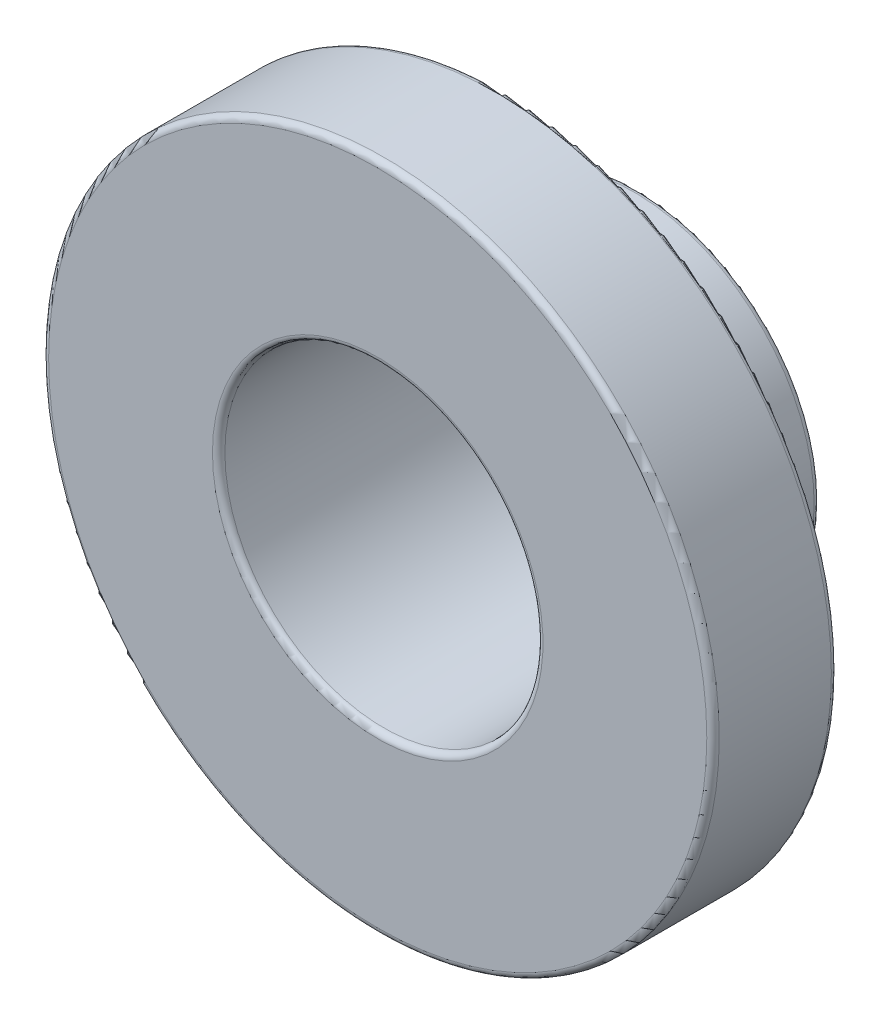
ISO-10303-21;
HEADER;
FILE_DESCRIPTION(('STEP AP214'),'2;1');
FILE_NAME('part.step','',(''),(''),'','','');
FILE_SCHEMA(('AUTOMOTIVE_DESIGN { 1 0 10303 214 1 1 1 1 }'));
ENDSEC;
DATA;
#1=APPLICATION_CONTEXT('core data for automotive mechanical design processes');
#2=APPLICATION_PROTOCOL_DEFINITION('international standard','automotive_design',2000,#1);
#3=PRODUCT_CONTEXT('',#1,'mechanical');
#4=PRODUCT('Part','Part','',(#3));
#5=PRODUCT_RELATED_PRODUCT_CATEGORY('part','',(#4));
#6=PRODUCT_DEFINITION_FORMATION('','',#4);
#7=PRODUCT_DEFINITION_CONTEXT('part definition',#1,'design');
#8=PRODUCT_DEFINITION('design','',#6,#7);
#9=PRODUCT_DEFINITION_SHAPE('','',#8);
#10=(LENGTH_UNIT() NAMED_UNIT(*) SI_UNIT(.MILLI.,.METRE.));
#11=(NAMED_UNIT(*) PLANE_ANGLE_UNIT() SI_UNIT($,.RADIAN.));
#12=(NAMED_UNIT(*) SI_UNIT($,.STERADIAN.) SOLID_ANGLE_UNIT());
#13=UNCERTAINTY_MEASURE_WITH_UNIT(LENGTH_MEASURE(1.E-05),#10,'distance_accuracy_value','');
#14=(GEOMETRIC_REPRESENTATION_CONTEXT(3) GLOBAL_UNCERTAINTY_ASSIGNED_CONTEXT((#13)) GLOBAL_UNIT_ASSIGNED_CONTEXT((#10,
#11,#12)) REPRESENTATION_CONTEXT('',''));
#15=CARTESIAN_POINT('',(0.,0.,0.));
#16=DIRECTION('',(0.,0.,1.));
#17=DIRECTION('',(1.,0.,0.));
#18=AXIS2_PLACEMENT_3D('',#15,#16,#17);
#19=CARTESIAN_POINT('',(0.,3.2131,1.2573));
#20=DIRECTION('',(0.,0.,-1.));
#21=DIRECTION('',(-1.,0.,0.));
#22=AXIS2_PLACEMENT_3D('',#19,#20,#21);
#23=PLANE('',#22);
#24=CARTESIAN_POINT('',(0.,0.,1.2573));
#25=DIRECTION('',(0.,0.,-1.));
#26=DIRECTION('',(-1.,0.,0.));
#27=AXIS2_PLACEMENT_3D('',#24,#25,#26);
#28=CIRCLE('',#27,1.58369);
#29=CARTESIAN_POINT('',(-1.58369,0.,1.2573));
#30=VERTEX_POINT('',#29);
#31=EDGE_CURVE('E62',#30,#30,#28,.T.);
#32=ORIENTED_EDGE('',*,*,#31,.T.);
#33=EDGE_LOOP('',(#32));
#34=FACE_BOUND('',#33,.T.);
#35=CARTESIAN_POINT('',(0.,0.,1.2573));
#36=DIRECTION('',(0.,0.,-1.));
#37=DIRECTION('',(-1.,0.,0.));
#38=AXIS2_PLACEMENT_3D('',#35,#36,#37);
#39=CIRCLE('',#38,3.15341);
#40=CARTESIAN_POINT('',(-3.15341,0.,1.2573));
#41=VERTEX_POINT('',#40);
#42=EDGE_CURVE('E65',#41,#41,#39,.F.);
#43=ORIENTED_EDGE('',*,*,#42,.T.);
#44=EDGE_LOOP('',(#43));
#45=FACE_BOUND('',#44,.T.);
#46=ADVANCED_FACE('F30',(#34,#45),#23,.F.);
#47=CARTESIAN_POINT('',(0.,0.,1.2573));
#48=DIRECTION('',(0.,0.,1.));
#49=DIRECTION('',(1.,0.,0.));
#50=AXIS2_PLACEMENT_3D('',#47,#48,#49);
#51=CYLINDRICAL_SURFACE('',#50,1.524);
#52=CARTESIAN_POINT('',(0.,0.,1.19761));
#53=DIRECTION('',(0.,0.,-1.));
#54=DIRECTION('',(-1.,0.,0.));
#55=AXIS2_PLACEMENT_3D('',#52,#53,#54);
#56=CIRCLE('',#55,1.524);
#57=CARTESIAN_POINT('',(-1.524,0.,1.19761));
#58=VERTEX_POINT('',#57);
#59=EDGE_CURVE('E68',#58,#58,#56,.F.);
#60=ORIENTED_EDGE('',*,*,#59,.T.);
#61=EDGE_LOOP('',(#60));
#62=FACE_BOUND('',#61,.T.);
#63=CARTESIAN_POINT('',(0.,0.,-1.19761));
#64=DIRECTION('',(0.,0.,1.));
#65=DIRECTION('',(1.,0.,0.));
#66=AXIS2_PLACEMENT_3D('',#63,#64,#65);
#67=CIRCLE('',#66,1.524);
#68=CARTESIAN_POINT('',(1.524,0.,-1.19761));
#69=VERTEX_POINT('',#68);
#70=EDGE_CURVE('E71',#69,#69,#67,.F.);
#71=ORIENTED_EDGE('',*,*,#70,.T.);
#72=EDGE_LOOP('',(#71));
#73=FACE_BOUND('',#72,.T.);
#74=ADVANCED_FACE('F75',(#62,#73),#51,.F.);
#75=CARTESIAN_POINT('',(0.,1.524,-1.2573));
#76=DIRECTION('',(0.,0.,1.));
#77=DIRECTION('',(1.,0.,0.));
#78=AXIS2_PLACEMENT_3D('',#75,#76,#77);
#79=PLANE('',#78);
#80=CARTESIAN_POINT('',(0.,0.,-1.2573));
#81=DIRECTION('',(0.,0.,1.));
#82=DIRECTION('',(1.,0.,0.));
#83=AXIS2_PLACEMENT_3D('',#80,#81,#82);
#84=CIRCLE('',#83,1.58369);
#85=CARTESIAN_POINT('',(1.58369,0.,-1.2573));
#86=VERTEX_POINT('',#85);
#87=EDGE_CURVE('E56',#86,#86,#84,.T.);
#88=ORIENTED_EDGE('',*,*,#87,.T.);
#89=EDGE_LOOP('',(#88));
#90=FACE_BOUND('',#89,.T.);
#91=CARTESIAN_POINT('',(0.,0.,-1.2573));
#92=DIRECTION('',(0.,0.,1.));
#93=DIRECTION('',(1.,0.,0.));
#94=AXIS2_PLACEMENT_3D('',#91,#92,#93);
#95=CIRCLE('',#94,1.66751);
#96=CARTESIAN_POINT('',(1.66751,0.,-1.2573));
#97=VERTEX_POINT('',#96);
#98=EDGE_CURVE('E59',#97,#97,#95,.F.);
#99=ORIENTED_EDGE('',*,*,#98,.T.);
#100=EDGE_LOOP('',(#99));
#101=FACE_BOUND('',#100,.T.);
#102=ADVANCED_FACE('F85',(#90,#101),#79,.F.);
#103=CARTESIAN_POINT('',(0.,0.,1.2573));
#104=DIRECTION('',(0.,0.,1.));
#105=DIRECTION('',(1.,0.,0.));
#106=AXIS2_PLACEMENT_3D('',#103,#104,#105);
#107=CYLINDRICAL_SURFACE('',#106,1.7272);
#108=CARTESIAN_POINT('',(0.,0.,-1.19761));
#109=DIRECTION('',(0.,0.,1.));
#110=DIRECTION('',(1.,0.,0.));
#111=AXIS2_PLACEMENT_3D('',#108,#109,#110);
#112=CIRCLE('',#111,1.7272);
#113=CARTESIAN_POINT('',(1.7272,0.,-1.19761));
#114=VERTEX_POINT('',#113);
#115=EDGE_CURVE('E50',#114,#114,#112,.T.);
#116=ORIENTED_EDGE('',*,*,#115,.T.);
#117=EDGE_LOOP('',(#116));
#118=FACE_BOUND('',#117,.T.);
#119=CARTESIAN_POINT('',(0.,0.,0.00381000000000404));
#120=DIRECTION('',(0.,0.,1.));
#121=DIRECTION('',(1.,0.,0.));
#122=AXIS2_PLACEMENT_3D('',#119,#120,#121);
#123=CIRCLE('',#122,1.7272);
#124=CARTESIAN_POINT('',(1.7272,0.,0.00381000000000404));
#125=VERTEX_POINT('',#124);
#126=EDGE_CURVE('E53',#125,#125,#123,.F.);
#127=ORIENTED_EDGE('',*,*,#126,.T.);
#128=EDGE_LOOP('',(#127));
#129=FACE_BOUND('',#128,.T.);
#130=ADVANCED_FACE('F88',(#118,#129),#107,.T.);
#131=CARTESIAN_POINT('',(0.,1.7272,0.0635000000000041));
#132=DIRECTION('',(0.,0.,1.));
#133=DIRECTION('',(1.,0.,0.));
#134=AXIS2_PLACEMENT_3D('',#131,#132,#133);
#135=PLANE('',#134);
#136=CARTESIAN_POINT('',(0.,0.,0.0635000000000041));
#137=DIRECTION('',(0.,0.,1.));
#138=DIRECTION('',(1.,0.,0.));
#139=AXIS2_PLACEMENT_3D('',#136,#137,#138);
#140=CIRCLE('',#139,1.78689);
#141=CARTESIAN_POINT('',(1.78689,0.,0.0635000000000041));
#142=VERTEX_POINT('',#141);
#143=EDGE_CURVE('E41',#142,#142,#140,.T.);
#144=ORIENTED_EDGE('',*,*,#143,.T.);
#145=EDGE_LOOP('',(#144));
#146=FACE_BOUND('',#145,.T.);
#147=CARTESIAN_POINT('',(0.,0.,0.0635000000000041));
#148=DIRECTION('',(0.,0.,1.));
#149=DIRECTION('',(1.,0.,0.));
#150=AXIS2_PLACEMENT_3D('',#147,#148,#149);
#151=CIRCLE('',#150,3.15341);
#152=CARTESIAN_POINT('',(3.15341,0.,0.0635000000000041));
#153=VERTEX_POINT('',#152);
#154=EDGE_CURVE('E45',#153,#153,#151,.F.);
#155=ORIENTED_EDGE('',*,*,#154,.T.);
#156=EDGE_LOOP('',(#155));
#157=FACE_BOUND('',#156,.T.);
#158=ADVANCED_FACE('F100',(#146,#157),#135,.F.);
#159=CARTESIAN_POINT('',(0.,0.,1.2573));
#160=DIRECTION('',(0.,0.,1.));
#161=DIRECTION('',(1.,0.,0.));
#162=AXIS2_PLACEMENT_3D('',#159,#160,#161);
#163=CYLINDRICAL_SURFACE('',#162,3.2131);
#164=CARTESIAN_POINT('',(0.,0.,0.123190000000004));
#165=DIRECTION('',(0.,0.,1.));
#166=DIRECTION('',(1.,0.,0.));
#167=AXIS2_PLACEMENT_3D('',#164,#165,#166);
#168=CIRCLE('',#167,3.2131);
#169=CARTESIAN_POINT('',(3.2131,0.,0.123190000000004));
#170=VERTEX_POINT('',#169);
#171=EDGE_CURVE('E10',#170,#170,#168,.T.);
#172=ORIENTED_EDGE('',*,*,#171,.T.);
#173=EDGE_LOOP('',(#172));
#174=FACE_BOUND('',#173,.T.);
#175=CARTESIAN_POINT('',(0.,0.,1.19761));
#176=DIRECTION('',(0.,0.,-1.));
#177=DIRECTION('',(-1.,0.,0.));
#178=AXIS2_PLACEMENT_3D('',#175,#176,#177);
#179=CIRCLE('',#178,3.2131);
#180=CARTESIAN_POINT('',(-3.2131,0.,1.19761));
#181=VERTEX_POINT('',#180);
#182=EDGE_CURVE('E37',#181,#181,#179,.T.);
#183=ORIENTED_EDGE('',*,*,#182,.T.);
#184=EDGE_LOOP('',(#183));
#185=FACE_BOUND('',#184,.T.);
#186=ADVANCED_FACE('F112',(#174,#185),#163,.T.);
#187=CARTESIAN_POINT('',(0.,0.,1.19761));
#188=DIRECTION('',(0.,0.,-1.));
#189=DIRECTION('',(-1.,0.,0.));
#190=AXIS2_PLACEMENT_3D('',#187,#188,#189);
#191=TOROIDAL_SURFACE('',#190,1.58369,0.05969);
#192=ORIENTED_EDGE('',*,*,#31,.F.);
#193=EDGE_LOOP('',(#192));
#194=FACE_BOUND('',#193,.T.);
#195=ORIENTED_EDGE('',*,*,#59,.F.);
#196=EDGE_LOOP('',(#195));
#197=FACE_BOUND('',#196,.T.);
#198=ADVANCED_FACE('F81',(#194,#197),#191,.T.);
#199=CARTESIAN_POINT('',(0.,0.,-1.19761));
#200=DIRECTION('',(0.,0.,1.));
#201=DIRECTION('',(1.,0.,0.));
#202=AXIS2_PLACEMENT_3D('',#199,#200,#201);
#203=TOROIDAL_SURFACE('',#202,1.58369,0.05969);
#204=ORIENTED_EDGE('',*,*,#70,.F.);
#205=EDGE_LOOP('',(#204));
#206=FACE_BOUND('',#205,.T.);
#207=ORIENTED_EDGE('',*,*,#87,.F.);
#208=EDGE_LOOP('',(#207));
#209=FACE_BOUND('',#208,.T.);
#210=ADVANCED_FACE('F77',(#206,#209),#203,.T.);
#211=CARTESIAN_POINT('',(0.,0.,-1.19761));
#212=DIRECTION('',(0.,0.,1.));
#213=DIRECTION('',(1.,0.,0.));
#214=AXIS2_PLACEMENT_3D('',#211,#212,#213);
#215=TOROIDAL_SURFACE('',#214,1.66751,0.05969);
#216=ORIENTED_EDGE('',*,*,#98,.F.);
#217=EDGE_LOOP('',(#216));
#218=FACE_BOUND('',#217,.T.);
#219=ORIENTED_EDGE('',*,*,#115,.F.);
#220=EDGE_LOOP('',(#219));
#221=FACE_BOUND('',#220,.T.);
#222=ADVANCED_FACE('F80',(#218,#221),#215,.T.);
#223=CARTESIAN_POINT('',(0.,0.,0.00381000000000404));
#224=DIRECTION('',(0.,0.,1.));
#225=DIRECTION('',(1.,0.,0.));
#226=AXIS2_PLACEMENT_3D('',#223,#224,#225);
#227=TOROIDAL_SURFACE('',#226,1.78689,0.05969);
#228=ORIENTED_EDGE('',*,*,#126,.F.);
#229=EDGE_LOOP('',(#228));
#230=FACE_BOUND('',#229,.T.);
#231=ORIENTED_EDGE('',*,*,#143,.F.);
#232=EDGE_LOOP('',(#231));
#233=FACE_BOUND('',#232,.T.);
#234=ADVANCED_FACE('F94',(#230,#233),#227,.F.);
#235=CARTESIAN_POINT('',(0.,0.,0.123190000000004));
#236=DIRECTION('',(0.,0.,1.));
#237=DIRECTION('',(1.,0.,0.));
#238=AXIS2_PLACEMENT_3D('',#235,#236,#237);
#239=TOROIDAL_SURFACE('',#238,3.15341,0.05969);
#240=ORIENTED_EDGE('',*,*,#154,.F.);
#241=EDGE_LOOP('',(#240));
#242=FACE_BOUND('',#241,.T.);
#243=ORIENTED_EDGE('',*,*,#171,.F.);
#244=EDGE_LOOP('',(#243));
#245=FACE_BOUND('',#244,.T.);
#246=ADVANCED_FACE('F106',(#242,#245),#239,.T.);
#247=CARTESIAN_POINT('',(0.,0.,1.19761));
#248=DIRECTION('',(0.,0.,-1.));
#249=DIRECTION('',(-1.,0.,0.));
#250=AXIS2_PLACEMENT_3D('',#247,#248,#249);
#251=TOROIDAL_SURFACE('',#250,3.15341,0.05969);
#252=ORIENTED_EDGE('',*,*,#182,.F.);
#253=EDGE_LOOP('',(#252));
#254=FACE_BOUND('',#253,.T.);
#255=ORIENTED_EDGE('',*,*,#42,.F.);
#256=EDGE_LOOP('',(#255));
#257=FACE_BOUND('',#256,.T.);
#258=ADVANCED_FACE('F32',(#254,#257),#251,.T.);
#259=CLOSED_SHELL('',(#46,#74,#102,#130,#158,#186,#198,#210,#222,#234,#246,#258));
#260=MANIFOLD_SOLID_BREP('B2',#259);
#261=ADVANCED_BREP_SHAPE_REPRESENTATION('',(#18,#260),#14);
#262=SHAPE_DEFINITION_REPRESENTATION(#9,#261);
ENDSEC;
END-ISO-10303-21;
